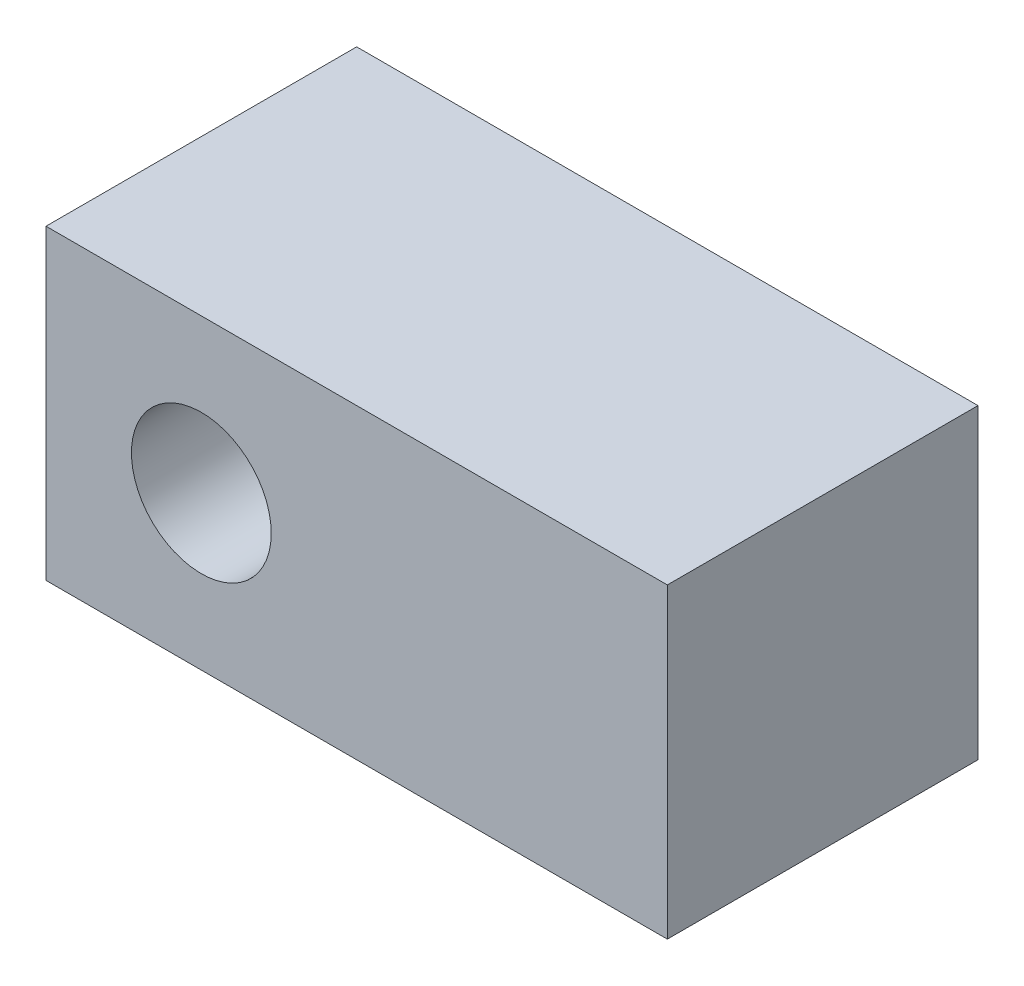
ISO-10303-21;
HEADER;
FILE_DESCRIPTION(('STEP AP214'),'2;1');
FILE_NAME('part.step','',(''),(''),'','','');
FILE_SCHEMA(('AUTOMOTIVE_DESIGN { 1 0 10303 214 1 1 1 1 }'));
ENDSEC;
DATA;
#1=APPLICATION_CONTEXT('core data for automotive mechanical design processes');
#2=APPLICATION_PROTOCOL_DEFINITION('international standard','automotive_design',2000,#1);
#3=PRODUCT_CONTEXT('',#1,'mechanical');
#4=PRODUCT('Part','Part','',(#3));
#5=PRODUCT_RELATED_PRODUCT_CATEGORY('part','',(#4));
#6=PRODUCT_DEFINITION_FORMATION('','',#4);
#7=PRODUCT_DEFINITION_CONTEXT('part definition',#1,'design');
#8=PRODUCT_DEFINITION('design','',#6,#7);
#9=PRODUCT_DEFINITION_SHAPE('','',#8);
#10=(LENGTH_UNIT() NAMED_UNIT(*) SI_UNIT(.MILLI.,.METRE.));
#11=(NAMED_UNIT(*) PLANE_ANGLE_UNIT() SI_UNIT($,.RADIAN.));
#12=(NAMED_UNIT(*) SI_UNIT($,.STERADIAN.) SOLID_ANGLE_UNIT());
#13=UNCERTAINTY_MEASURE_WITH_UNIT(LENGTH_MEASURE(1.E-05),#10,'distance_accuracy_value','');
#14=(GEOMETRIC_REPRESENTATION_CONTEXT(3) GLOBAL_UNCERTAINTY_ASSIGNED_CONTEXT((#13)) GLOBAL_UNIT_ASSIGNED_CONTEXT((#10,
#11,#12)) REPRESENTATION_CONTEXT('',''));
#15=CARTESIAN_POINT('',(0.,0.,0.));
#16=DIRECTION('',(0.,0.,1.));
#17=DIRECTION('',(1.,0.,0.));
#18=AXIS2_PLACEMENT_3D('',#15,#16,#17);
#19=CARTESIAN_POINT('',(0.,0.,20.));
#20=DIRECTION('',(0.,0.,-1.));
#21=DIRECTION('',(-1.,0.,0.));
#22=AXIS2_PLACEMENT_3D('',#19,#20,#21);
#23=PLANE('',#22);
#24=DIRECTION('',(0.,-1.,0.));
#25=VECTOR('',#24,1.);
#26=CARTESIAN_POINT('',(0.,0.,20.));
#27=LINE('',#26,#25);
#28=CARTESIAN_POINT('',(0.,19.7488924060281,20.));
#29=VERTEX_POINT('',#28);
#30=CARTESIAN_POINT('',(0.,0.,20.));
#31=VERTEX_POINT('',#30);
#32=EDGE_CURVE('E92',#29,#31,#27,.T.);
#33=ORIENTED_EDGE('',*,*,#32,.T.);
#34=DIRECTION('',(1.,0.,0.));
#35=VECTOR('',#34,1.);
#36=CARTESIAN_POINT('',(0.,0.,20.));
#37=LINE('',#36,#35);
#38=CARTESIAN_POINT('',(40.,0.,20.));
#39=VERTEX_POINT('',#38);
#40=EDGE_CURVE('E87',#31,#39,#37,.T.);
#41=ORIENTED_EDGE('',*,*,#40,.T.);
#42=DIRECTION('',(0.,1.,0.));
#43=VECTOR('',#42,1.);
#44=CARTESIAN_POINT('',(40.,0.,20.));
#45=LINE('',#44,#43);
#46=CARTESIAN_POINT('',(40.,19.7488924060281,20.));
#47=VERTEX_POINT('',#46);
#48=EDGE_CURVE('E90',#39,#47,#45,.T.);
#49=ORIENTED_EDGE('',*,*,#48,.T.);
#50=DIRECTION('',(-1.,0.,0.));
#51=VECTOR('',#50,1.);
#52=CARTESIAN_POINT('',(0.,19.7488924060281,20.));
#53=LINE('',#52,#51);
#54=EDGE_CURVE('E57',#47,#29,#53,.T.);
#55=ORIENTED_EDGE('',*,*,#54,.T.);
#56=EDGE_LOOP('',(#33,#41,#49,#55));
#57=FACE_BOUND('',#56,.T.);
#58=CARTESIAN_POINT('',(10.,9.87444620301403,20.));
#59=DIRECTION('',(0.,0.,1.));
#60=DIRECTION('',(1.,0.,0.));
#61=AXIS2_PLACEMENT_3D('',#58,#59,#60);
#62=CIRCLE('',#61,4.5);
#63=CARTESIAN_POINT('',(14.5,9.87444620301403,20.));
#64=VERTEX_POINT('',#63);
#65=EDGE_CURVE('E112',#64,#64,#62,.T.);
#66=ORIENTED_EDGE('',*,*,#65,.F.);
#67=EDGE_LOOP('',(#66));
#68=FACE_BOUND('',#67,.T.);
#69=ADVANCED_FACE('F39',(#57,#68),#23,.F.);
#70=CARTESIAN_POINT('',(0.,0.,0.));
#71=DIRECTION('',(0.,0.,-1.));
#72=DIRECTION('',(-1.,0.,0.));
#73=AXIS2_PLACEMENT_3D('',#70,#71,#72);
#74=PLANE('',#73);
#75=DIRECTION('',(0.,-1.,0.));
#76=VECTOR('',#75,1.);
#77=CARTESIAN_POINT('',(0.,0.,0.));
#78=LINE('',#77,#76);
#79=CARTESIAN_POINT('',(0.,19.7488924060281,0.));
#80=VERTEX_POINT('',#79);
#81=CARTESIAN_POINT('',(0.,0.,0.));
#82=VERTEX_POINT('',#81);
#83=EDGE_CURVE('E108',#80,#82,#78,.T.);
#84=ORIENTED_EDGE('',*,*,#83,.F.);
#85=DIRECTION('',(-1.,0.,0.));
#86=VECTOR('',#85,1.);
#87=CARTESIAN_POINT('',(0.,19.7488924060281,0.));
#88=LINE('',#87,#86);
#89=CARTESIAN_POINT('',(40.,19.7488924060281,0.));
#90=VERTEX_POINT('',#89);
#91=EDGE_CURVE('E80',#90,#80,#88,.T.);
#92=ORIENTED_EDGE('',*,*,#91,.F.);
#93=DIRECTION('',(0.,1.,0.));
#94=VECTOR('',#93,1.);
#95=CARTESIAN_POINT('',(40.,0.,0.));
#96=LINE('',#95,#94);
#97=CARTESIAN_POINT('',(40.,0.,0.));
#98=VERTEX_POINT('',#97);
#99=EDGE_CURVE('E74',#98,#90,#96,.T.);
#100=ORIENTED_EDGE('',*,*,#99,.F.);
#101=DIRECTION('',(1.,0.,0.));
#102=VECTOR('',#101,1.);
#103=CARTESIAN_POINT('',(0.,0.,0.));
#104=LINE('',#103,#102);
#105=EDGE_CURVE('E97',#82,#98,#104,.T.);
#106=ORIENTED_EDGE('',*,*,#105,.F.);
#107=EDGE_LOOP('',(#84,#92,#100,#106));
#108=FACE_BOUND('',#107,.T.);
#109=CARTESIAN_POINT('',(10.,9.87444620301403,0.));
#110=DIRECTION('',(0.,0.,1.));
#111=DIRECTION('',(1.,0.,0.));
#112=AXIS2_PLACEMENT_3D('',#109,#110,#111);
#113=CIRCLE('',#112,4.5);
#114=CARTESIAN_POINT('',(14.5,9.87444620301403,0.));
#115=VERTEX_POINT('',#114);
#116=EDGE_CURVE('E130',#115,#115,#113,.T.);
#117=ORIENTED_EDGE('',*,*,#116,.T.);
#118=EDGE_LOOP('',(#117));
#119=FACE_BOUND('',#118,.T.);
#120=ADVANCED_FACE('F125',(#108,#119),#74,.T.);
#121=CARTESIAN_POINT('',(0.,0.,20.));
#122=DIRECTION('',(1.,0.,0.));
#123=DIRECTION('',(0.,0.,-1.));
#124=AXIS2_PLACEMENT_3D('',#121,#122,#123);
#125=PLANE('',#124);
#126=ORIENTED_EDGE('',*,*,#83,.T.);
#127=DIRECTION('',(0.,0.,-1.));
#128=VECTOR('',#127,1.);
#129=CARTESIAN_POINT('',(0.,0.,20.));
#130=LINE('',#129,#128);
#131=EDGE_CURVE('E11',#31,#82,#130,.T.);
#132=ORIENTED_EDGE('',*,*,#131,.F.);
#133=ORIENTED_EDGE('',*,*,#32,.F.);
#134=DIRECTION('',(0.,0.,-1.));
#135=VECTOR('',#134,1.);
#136=CARTESIAN_POINT('',(0.,19.7488924060281,20.));
#137=LINE('',#136,#135);
#138=EDGE_CURVE('E104',#29,#80,#137,.T.);
#139=ORIENTED_EDGE('',*,*,#138,.T.);
#140=EDGE_LOOP('',(#126,#132,#133,#139));
#141=FACE_BOUND('',#140,.T.);
#142=ADVANCED_FACE('F41',(#141),#125,.F.);
#143=CARTESIAN_POINT('',(0.,0.,20.));
#144=DIRECTION('',(0.,1.,0.));
#145=DIRECTION('',(-1.,0.,0.));
#146=AXIS2_PLACEMENT_3D('',#143,#144,#145);
#147=PLANE('',#146);
#148=ORIENTED_EDGE('',*,*,#105,.T.);
#149=DIRECTION('',(0.,0.,-1.));
#150=VECTOR('',#149,1.);
#151=CARTESIAN_POINT('',(40.,0.,20.));
#152=LINE('',#151,#150);
#153=EDGE_CURVE('E49',#39,#98,#152,.T.);
#154=ORIENTED_EDGE('',*,*,#153,.F.);
#155=ORIENTED_EDGE('',*,*,#40,.F.);
#156=ORIENTED_EDGE('',*,*,#131,.T.);
#157=EDGE_LOOP('',(#148,#154,#155,#156));
#158=FACE_BOUND('',#157,.T.);
#159=ADVANCED_FACE('F96',(#158),#147,.F.);
#160=CARTESIAN_POINT('',(40.,0.,20.));
#161=DIRECTION('',(-1.,0.,0.));
#162=DIRECTION('',(0.,-1.,0.));
#163=AXIS2_PLACEMENT_3D('',#160,#161,#162);
#164=PLANE('',#163);
#165=ORIENTED_EDGE('',*,*,#99,.T.);
#166=DIRECTION('',(0.,0.,-1.));
#167=VECTOR('',#166,1.);
#168=CARTESIAN_POINT('',(40.,19.7488924060281,20.));
#169=LINE('',#168,#167);
#170=EDGE_CURVE('E99',#47,#90,#169,.T.);
#171=ORIENTED_EDGE('',*,*,#170,.F.);
#172=ORIENTED_EDGE('',*,*,#48,.F.);
#173=ORIENTED_EDGE('',*,*,#153,.T.);
#174=EDGE_LOOP('',(#165,#171,#172,#173));
#175=FACE_BOUND('',#174,.T.);
#176=ADVANCED_FACE('F100',(#175),#164,.F.);
#177=CARTESIAN_POINT('',(0.,19.7488924060281,20.));
#178=DIRECTION('',(0.,-1.,0.));
#179=DIRECTION('',(0.,0.,-1.));
#180=AXIS2_PLACEMENT_3D('',#177,#178,#179);
#181=PLANE('',#180);
#182=ORIENTED_EDGE('',*,*,#91,.T.);
#183=ORIENTED_EDGE('',*,*,#138,.F.);
#184=ORIENTED_EDGE('',*,*,#54,.F.);
#185=ORIENTED_EDGE('',*,*,#170,.T.);
#186=EDGE_LOOP('',(#182,#183,#184,#185));
#187=FACE_BOUND('',#186,.T.);
#188=ADVANCED_FACE('F122',(#187),#181,.F.);
#189=CARTESIAN_POINT('',(10.,9.87444620301403,20.));
#190=DIRECTION('',(0.,0.,-1.));
#191=DIRECTION('',(-1.,0.,0.));
#192=AXIS2_PLACEMENT_3D('',#189,#190,#191);
#193=CYLINDRICAL_SURFACE('',#192,4.5);
#194=ORIENTED_EDGE('',*,*,#65,.T.);
#195=EDGE_LOOP('',(#194));
#196=FACE_BOUND('',#195,.T.);
#197=ORIENTED_EDGE('',*,*,#116,.F.);
#198=EDGE_LOOP('',(#197));
#199=FACE_BOUND('',#198,.T.);
#200=ADVANCED_FACE('F138',(#196,#199),#193,.F.);
#201=CLOSED_SHELL('',(#69,#120,#142,#159,#176,#188,#200));
#202=MANIFOLD_SOLID_BREP('B2',#201);
#203=ADVANCED_BREP_SHAPE_REPRESENTATION('',(#18,#202),#14);
#204=SHAPE_DEFINITION_REPRESENTATION(#9,#203);
ENDSEC;
END-ISO-10303-21;
